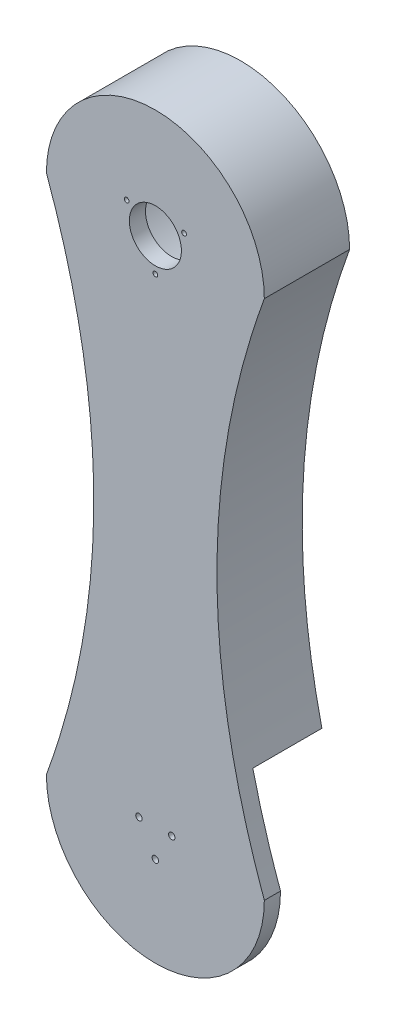
ISO-10303-21;
HEADER;
FILE_DESCRIPTION(('STEP AP214'),'2;1');
FILE_NAME('part.step','',(''),(''),'','','');
FILE_SCHEMA(('AUTOMOTIVE_DESIGN { 1 0 10303 214 1 1 1 1 }'));
ENDSEC;
DATA;
#1=APPLICATION_CONTEXT('core data for automotive mechanical design processes');
#2=APPLICATION_PROTOCOL_DEFINITION('international standard','automotive_design',2000,#1);
#3=PRODUCT_CONTEXT('',#1,'mechanical');
#4=PRODUCT('Part','Part','',(#3));
#5=PRODUCT_RELATED_PRODUCT_CATEGORY('part','',(#4));
#6=PRODUCT_DEFINITION_FORMATION('','',#4);
#7=PRODUCT_DEFINITION_CONTEXT('part definition',#1,'design');
#8=PRODUCT_DEFINITION('design','',#6,#7);
#9=PRODUCT_DEFINITION_SHAPE('','',#8);
#10=(LENGTH_UNIT() NAMED_UNIT(*) SI_UNIT(.MILLI.,.METRE.));
#11=(NAMED_UNIT(*) PLANE_ANGLE_UNIT() SI_UNIT($,.RADIAN.));
#12=(NAMED_UNIT(*) SI_UNIT($,.STERADIAN.) SOLID_ANGLE_UNIT());
#13=UNCERTAINTY_MEASURE_WITH_UNIT(LENGTH_MEASURE(1.E-05),#10,'distance_accuracy_value','');
#14=(GEOMETRIC_REPRESENTATION_CONTEXT(3) GLOBAL_UNCERTAINTY_ASSIGNED_CONTEXT((#13)) GLOBAL_UNIT_ASSIGNED_CONTEXT((#10,
#11,#12)) REPRESENTATION_CONTEXT('',''));
#15=CARTESIAN_POINT('',(0.,0.,0.));
#16=DIRECTION('',(0.,0.,1.));
#17=DIRECTION('',(1.,0.,0.));
#18=AXIS2_PLACEMENT_3D('',#15,#16,#17);
#19=CARTESIAN_POINT('',(0.,0.,90.));
#20=DIRECTION('',(0.,0.,-1.));
#21=DIRECTION('',(-1.,0.,0.));
#22=AXIS2_PLACEMENT_3D('',#19,#20,#21);
#23=CYLINDRICAL_SURFACE('',#22,115.);
#24=CARTESIAN_POINT('',(0.,0.,72.91));
#25=DIRECTION('',(0.,0.,-1.));
#26=DIRECTION('',(-1.,0.,0.));
#27=AXIS2_PLACEMENT_3D('',#24,#25,#26);
#28=CIRCLE('',#27,115.);
#29=CARTESIAN_POINT('',(-115.,0.,72.91));
#30=VERTEX_POINT('',#29);
#31=CARTESIAN_POINT('',(114.999999863721,3.75072417568845E-07,72.91));
#32=VERTEX_POINT('',#31);
#33=EDGE_CURVE('E194',#30,#32,#28,.F.);
#34=ORIENTED_EDGE('',*,*,#33,.T.);
#35=DIRECTION('',(0.,0.,-1.));
#36=VECTOR('',#35,1.);
#37=CARTESIAN_POINT('',(115.,0.,90.));
#38=LINE('',#37,#36);
#39=CARTESIAN_POINT('',(115.,0.,90.));
#40=VERTEX_POINT('',#39);
#41=EDGE_CURVE('E51',#40,#32,#38,.T.);
#42=ORIENTED_EDGE('',*,*,#41,.F.);
#43=CARTESIAN_POINT('',(0.,0.,90.));
#44=DIRECTION('',(0.,0.,1.));
#45=DIRECTION('',(1.,0.,0.));
#46=AXIS2_PLACEMENT_3D('',#43,#44,#45);
#47=CIRCLE('',#46,115.);
#48=CARTESIAN_POINT('',(-115.,0.,90.));
#49=VERTEX_POINT('',#48);
#50=EDGE_CURVE('E90',#49,#40,#47,.T.);
#51=ORIENTED_EDGE('',*,*,#50,.F.);
#52=DIRECTION('',(0.,0.,-1.));
#53=VECTOR('',#52,1.);
#54=CARTESIAN_POINT('',(-115.,0.,90.));
#55=LINE('',#54,#53);
#56=EDGE_CURVE('E11',#49,#30,#55,.T.);
#57=ORIENTED_EDGE('',*,*,#56,.T.);
#58=EDGE_LOOP('',(#34,#42,#51,#57));
#59=FACE_BOUND('',#58,.T.);
#60=ADVANCED_FACE('F39',(#59),#23,.T.);
#61=CARTESIAN_POINT('',(-115.,550.,90.));
#62=CARTESIAN_POINT('',(-15.,275.,90.));
#63=CARTESIAN_POINT('',(-115.,0.,90.));
#64=B_SPLINE_CURVE_WITH_KNOTS('',2,(#61,#62,#63),.UNSPECIFIED.,.F.,.F.,(3,3),(0.,1.),.UNSPECIFIED.);
#65=DIRECTION('',(0.,0.,-1.));
#66=VECTOR('',#65,1.);
#67=SURFACE_OF_LINEAR_EXTRUSION('',#64,#66);
#68=CARTESIAN_POINT('',(-115.,550.,0.));
#69=CARTESIAN_POINT('',(-15.,275.,0.));
#70=CARTESIAN_POINT('',(-115.,0.,0.));
#71=B_SPLINE_CURVE_WITH_KNOTS('',2,(#68,#69,#70),.UNSPECIFIED.,.F.,.F.,(3,3),(0.,1.),.UNSPECIFIED.);
#72=CARTESIAN_POINT('',(-115.,550.,0.));
#73=VERTEX_POINT('',#72);
#74=CARTESIAN_POINT('',(-85.785633536832,97.6915943209165,0.));
#75=VERTEX_POINT('',#74);
#76=EDGE_CURVE('E124',#73,#75,#71,.T.);
#77=ORIENTED_EDGE('',*,*,#76,.T.);
#78=DIRECTION('',(0.,0.,-1.));
#79=VECTOR('',#78,1.);
#80=CARTESIAN_POINT('',(-85.7856335369576,97.6915943208549,400.044320324586));
#81=LINE('',#80,#79);
#82=CARTESIAN_POINT('',(-85.7856335369576,97.6915943208549,72.91));
#83=VERTEX_POINT('',#82);
#84=EDGE_CURVE('E59',#83,#75,#81,.T.);
#85=ORIENTED_EDGE('',*,*,#84,.F.);
#86=CARTESIAN_POINT('',(-1000065.,-38615.8729652601,72.91));
#87=CARTESIAN_POINT('',(999935.,274.999999999999,72.91));
#88=CARTESIAN_POINT('',(-1000065.,39165.8729652601,72.91));
#89=B_SPLINE_CURVE_WITH_KNOTS('',2,(#86,#87,#88),.UNSPECIFIED.,.F.,.F.,(3,3),(0.,1.),.UNSPECIFIED.);
#90=EDGE_CURVE('E162',#83,#30,#89,.F.);
#91=ORIENTED_EDGE('',*,*,#90,.T.);
#92=ORIENTED_EDGE('',*,*,#56,.F.);
#93=CARTESIAN_POINT('',(-115.,550.,90.));
#94=VERTEX_POINT('',#93);
#95=EDGE_CURVE('E126',#94,#49,#64,.T.);
#96=ORIENTED_EDGE('',*,*,#95,.F.);
#97=DIRECTION('',(0.,0.,-1.));
#98=VECTOR('',#97,1.);
#99=CARTESIAN_POINT('',(-115.,550.,90.));
#100=LINE('',#99,#98);
#101=EDGE_CURVE('E146',#94,#73,#100,.T.);
#102=ORIENTED_EDGE('',*,*,#101,.T.);
#103=EDGE_LOOP('',(#77,#85,#91,#92,#96,#102));
#104=FACE_BOUND('',#103,.T.);
#105=ADVANCED_FACE('F41',(#104),#67,.F.);
#106=CARTESIAN_POINT('',(115.,0.,90.));
#107=CARTESIAN_POINT('',(15.,275.,90.));
#108=CARTESIAN_POINT('',(115.,550.,90.));
#109=B_SPLINE_CURVE_WITH_KNOTS('',2,(#106,#107,#108),.UNSPECIFIED.,.F.,.F.,(3,3),(0.,1.),.UNSPECIFIED.);
#110=DIRECTION('',(0.,0.,-1.));
#111=VECTOR('',#110,1.);
#112=SURFACE_OF_LINEAR_EXTRUSION('',#109,#111);
#113=CARTESIAN_POINT('',(1000065.,39165.8729652601,72.91));
#114=CARTESIAN_POINT('',(-999935.,274.999999999999,72.91));
#115=CARTESIAN_POINT('',(1000065.,-38615.8729652601,72.91));
#116=B_SPLINE_CURVE_WITH_KNOTS('',2,(#113,#114,#115),.UNSPECIFIED.,.F.,.F.,(3,3),(0.,1.),.UNSPECIFIED.);
#117=CARTESIAN_POINT('',(85.7856335369571,97.6915943208549,72.91));
#118=VERTEX_POINT('',#117);
#119=EDGE_CURVE('E120',#32,#118,#116,.F.);
#120=ORIENTED_EDGE('',*,*,#119,.T.);
#121=DIRECTION('',(0.,0.,-1.));
#122=VECTOR('',#121,1.);
#123=CARTESIAN_POINT('',(85.7856335369571,97.6915943208549,400.044320324586));
#124=LINE('',#123,#122);
#125=CARTESIAN_POINT('',(85.7856335369571,97.6915943208549,0.));
#126=VERTEX_POINT('',#125);
#127=EDGE_CURVE('E106',#118,#126,#124,.T.);
#128=ORIENTED_EDGE('',*,*,#127,.T.);
#129=CARTESIAN_POINT('',(115.,0.,0.));
#130=CARTESIAN_POINT('',(15.,275.,0.));
#131=CARTESIAN_POINT('',(115.,550.,0.));
#132=B_SPLINE_CURVE_WITH_KNOTS('',2,(#129,#130,#131),.UNSPECIFIED.,.F.,.F.,(3,3),(0.,1.),.UNSPECIFIED.);
#133=CARTESIAN_POINT('',(115.,550.,0.));
#134=VERTEX_POINT('',#133);
#135=EDGE_CURVE('E118',#126,#134,#132,.T.);
#136=ORIENTED_EDGE('',*,*,#135,.T.);
#137=DIRECTION('',(0.,0.,-1.));
#138=VECTOR('',#137,1.);
#139=CARTESIAN_POINT('',(115.,550.,90.));
#140=LINE('',#139,#138);
#141=CARTESIAN_POINT('',(115.,550.,90.));
#142=VERTEX_POINT('',#141);
#143=EDGE_CURVE('E148',#142,#134,#140,.T.);
#144=ORIENTED_EDGE('',*,*,#143,.F.);
#145=EDGE_CURVE('E175',#40,#142,#109,.T.);
#146=ORIENTED_EDGE('',*,*,#145,.F.);
#147=ORIENTED_EDGE('',*,*,#41,.T.);
#148=EDGE_LOOP('',(#120,#128,#136,#144,#146,#147));
#149=FACE_BOUND('',#148,.T.);
#150=ADVANCED_FACE('F116',(#149),#112,.F.);
#151=CARTESIAN_POINT('',(0.,550.,90.));
#152=DIRECTION('',(0.,0.,-1.));
#153=DIRECTION('',(-1.,0.,0.));
#154=AXIS2_PLACEMENT_3D('',#151,#152,#153);
#155=CYLINDRICAL_SURFACE('',#154,115.);
#156=CARTESIAN_POINT('',(0.,550.,0.));
#157=DIRECTION('',(0.,0.,1.));
#158=DIRECTION('',(1.,0.,0.));
#159=AXIS2_PLACEMENT_3D('',#156,#157,#158);
#160=CIRCLE('',#159,115.);
#161=EDGE_CURVE('E83',#134,#73,#160,.T.);
#162=ORIENTED_EDGE('',*,*,#161,.T.);
#163=ORIENTED_EDGE('',*,*,#101,.F.);
#164=CARTESIAN_POINT('',(0.,550.,90.));
#165=DIRECTION('',(0.,0.,1.));
#166=DIRECTION('',(1.,0.,0.));
#167=AXIS2_PLACEMENT_3D('',#164,#165,#166);
#168=CIRCLE('',#167,115.);
#169=EDGE_CURVE('E68',#142,#94,#168,.T.);
#170=ORIENTED_EDGE('',*,*,#169,.F.);
#171=ORIENTED_EDGE('',*,*,#143,.T.);
#172=EDGE_LOOP('',(#162,#163,#170,#171));
#173=FACE_BOUND('',#172,.T.);
#174=ADVANCED_FACE('F185',(#173),#155,.T.);
#175=CARTESIAN_POINT('',(-65.,275.,90.));
#176=DIRECTION('',(0.,0.,-1.));
#177=DIRECTION('',(-1.,0.,0.));
#178=AXIS2_PLACEMENT_3D('',#175,#176,#177);
#179=PLANE('',#178);
#180=CARTESIAN_POINT('',(-30.3108891324553,567.5,90.));
#181=DIRECTION('',(0.,0.,1.));
#182=DIRECTION('',(-0.500000000000004,-0.866025403784436,0.));
#183=AXIS2_PLACEMENT_3D('',#180,#181,#182);
#184=CIRCLE('',#183,2.5);
#185=CARTESIAN_POINT('',(-31.5608891324553,565.334936490539,90.));
#186=VERTEX_POINT('',#185);
#187=EDGE_CURVE('E289',#186,#186,#184,.T.);
#188=ORIENTED_EDGE('',*,*,#187,.F.);
#189=EDGE_LOOP('',(#188));
#190=FACE_BOUND('',#189,.T.);
#191=CARTESIAN_POINT('',(30.3108891324556,567.5,90.));
#192=DIRECTION('',(0.,0.,1.));
#193=DIRECTION('',(-0.499999999999992,0.866025403784443,0.));
#194=AXIS2_PLACEMENT_3D('',#191,#192,#193);
#195=CIRCLE('',#194,2.5);
#196=CARTESIAN_POINT('',(29.0608891324556,569.665063509461,90.));
#197=VERTEX_POINT('',#196);
#198=EDGE_CURVE('E300',#197,#197,#195,.T.);
#199=ORIENTED_EDGE('',*,*,#198,.F.);
#200=EDGE_LOOP('',(#199));
#201=FACE_BOUND('',#200,.T.);
#202=CARTESIAN_POINT('',(0.,515.,90.));
#203=DIRECTION('',(0.,0.,1.));
#204=DIRECTION('',(1.,0.,0.));
#205=AXIS2_PLACEMENT_3D('',#202,#203,#204);
#206=CIRCLE('',#205,2.5);
#207=CARTESIAN_POINT('',(2.5,515.,90.));
#208=VERTEX_POINT('',#207);
#209=EDGE_CURVE('E292',#208,#208,#206,.T.);
#210=ORIENTED_EDGE('',*,*,#209,.F.);
#211=EDGE_LOOP('',(#210));
#212=FACE_BOUND('',#211,.T.);
#213=CARTESIAN_POINT('',(0.,-20.,90.));
#214=DIRECTION('',(0.,0.,-1.));
#215=DIRECTION('',(-1.,0.,0.));
#216=AXIS2_PLACEMENT_3D('',#213,#214,#215);
#217=CIRCLE('',#216,3.4);
#218=CARTESIAN_POINT('',(-3.4,-20.,90.));
#219=VERTEX_POINT('',#218);
#220=EDGE_CURVE('E112',#219,#219,#217,.F.);
#221=ORIENTED_EDGE('',*,*,#220,.F.);
#222=EDGE_LOOP('',(#221));
#223=FACE_BOUND('',#222,.T.);
#224=CARTESIAN_POINT('',(-17.3205080756887,10.0000000000001,90.));
#225=DIRECTION('',(0.,0.,-1.));
#226=DIRECTION('',(-1.,0.,0.));
#227=AXIS2_PLACEMENT_3D('',#224,#225,#226);
#228=CIRCLE('',#227,3.4);
#229=CARTESIAN_POINT('',(-20.7205080756887,10.0000000000001,90.));
#230=VERTEX_POINT('',#229);
#231=EDGE_CURVE('E314',#230,#230,#228,.F.);
#232=ORIENTED_EDGE('',*,*,#231,.F.);
#233=EDGE_LOOP('',(#232));
#234=FACE_BOUND('',#233,.T.);
#235=CARTESIAN_POINT('',(17.3205080756889,9.99999999999983,90.));
#236=DIRECTION('',(0.,0.,-1.));
#237=DIRECTION('',(-1.,0.,0.));
#238=AXIS2_PLACEMENT_3D('',#235,#236,#237);
#239=CIRCLE('',#238,3.4);
#240=CARTESIAN_POINT('',(13.9205080756889,9.99999999999983,90.));
#241=VERTEX_POINT('',#240);
#242=EDGE_CURVE('E307',#241,#241,#239,.F.);
#243=ORIENTED_EDGE('',*,*,#242,.F.);
#244=EDGE_LOOP('',(#243));
#245=FACE_BOUND('',#244,.T.);
#246=CARTESIAN_POINT('',(0.,550.,90.));
#247=DIRECTION('',(0.,0.,-1.));
#248=DIRECTION('',(-1.,0.,0.));
#249=AXIS2_PLACEMENT_3D('',#246,#247,#248);
#250=CIRCLE('',#249,27.5);
#251=CARTESIAN_POINT('',(-27.5,550.,90.));
#252=VERTEX_POINT('',#251);
#253=EDGE_CURVE('E149',#252,#252,#250,.T.);
#254=ORIENTED_EDGE('',*,*,#253,.T.);
#255=EDGE_LOOP('',(#254));
#256=FACE_BOUND('',#255,.T.);
#257=ORIENTED_EDGE('',*,*,#95,.T.);
#258=ORIENTED_EDGE('',*,*,#50,.T.);
#259=ORIENTED_EDGE('',*,*,#145,.T.);
#260=ORIENTED_EDGE('',*,*,#169,.T.);
#261=EDGE_LOOP('',(#257,#258,#259,#260));
#262=FACE_BOUND('',#261,.T.);
#263=ADVANCED_FACE('F201',(#190,#201,#212,#223,#234,#245,#256,#262),#179,.F.);
#264=CARTESIAN_POINT('',(-65.,275.,0.));
#265=DIRECTION('',(0.,0.,-1.));
#266=DIRECTION('',(-1.,0.,0.));
#267=AXIS2_PLACEMENT_3D('',#264,#265,#266);
#268=PLANE('',#267);
#269=CARTESIAN_POINT('',(-2.22044604925031E-13,-76.8838557921613,0.));
#270=DIRECTION('',(0.,0.,-1.));
#271=DIRECTION('',(-1.,0.,0.));
#272=AXIS2_PLACEMENT_3D('',#269,#270,#271);
#273=CIRCLE('',#272,194.514170958055);
#274=EDGE_CURVE('E103',#75,#126,#273,.T.);
#275=ORIENTED_EDGE('',*,*,#274,.F.);
#276=ORIENTED_EDGE('',*,*,#76,.F.);
#277=ORIENTED_EDGE('',*,*,#161,.F.);
#278=ORIENTED_EDGE('',*,*,#135,.F.);
#279=EDGE_LOOP('',(#275,#276,#277,#278));
#280=FACE_BOUND('',#279,.T.);
#281=CARTESIAN_POINT('',(0.,550.,0.));
#282=DIRECTION('',(0.,0.,-1.));
#283=DIRECTION('',(-1.,0.,0.));
#284=AXIS2_PLACEMENT_3D('',#281,#282,#283);
#285=CIRCLE('',#284,97.5);
#286=CARTESIAN_POINT('',(-97.5,550.,0.));
#287=VERTEX_POINT('',#286);
#288=EDGE_CURVE('E151',#287,#287,#285,.T.);
#289=ORIENTED_EDGE('',*,*,#288,.F.);
#290=EDGE_LOOP('',(#289));
#291=FACE_BOUND('',#290,.T.);
#292=ADVANCED_FACE('F122',(#280,#291),#268,.T.);
#293=CARTESIAN_POINT('',(0.,550.,72.91));
#294=DIRECTION('',(0.,0.,-1.));
#295=DIRECTION('',(-1.,0.,0.));
#296=AXIS2_PLACEMENT_3D('',#293,#294,#295);
#297=CYLINDRICAL_SURFACE('',#296,97.5);
#298=CARTESIAN_POINT('',(0.,550.,72.91));
#299=DIRECTION('',(0.,0.,-1.));
#300=DIRECTION('',(-1.,0.,0.));
#301=AXIS2_PLACEMENT_3D('',#298,#299,#300);
#302=CIRCLE('',#301,97.5);
#303=CARTESIAN_POINT('',(-97.5,550.,72.91));
#304=VERTEX_POINT('',#303);
#305=EDGE_CURVE('E128',#304,#304,#302,.T.);
#306=ORIENTED_EDGE('',*,*,#305,.F.);
#307=EDGE_LOOP('',(#306));
#308=FACE_BOUND('',#307,.T.);
#309=ORIENTED_EDGE('',*,*,#288,.T.);
#310=EDGE_LOOP('',(#309));
#311=FACE_BOUND('',#310,.T.);
#312=ADVANCED_FACE('F241',(#308,#311),#297,.F.);
#313=CARTESIAN_POINT('',(0.,550.,72.91));
#314=DIRECTION('',(0.,0.,-1.));
#315=DIRECTION('',(-1.,0.,0.));
#316=AXIS2_PLACEMENT_3D('',#313,#314,#315);
#317=PLANE('',#316);
#318=CARTESIAN_POINT('',(-30.3108891324553,567.5,72.91));
#319=DIRECTION('',(0.,0.,-1.));
#320=DIRECTION('',(-1.,0.,0.));
#321=AXIS2_PLACEMENT_3D('',#318,#319,#320);
#322=CIRCLE('',#321,2.5);
#323=CARTESIAN_POINT('',(-32.8108891324553,567.5,72.91));
#324=VERTEX_POINT('',#323);
#325=EDGE_CURVE('E291',#324,#324,#322,.F.);
#326=ORIENTED_EDGE('',*,*,#325,.T.);
#327=EDGE_LOOP('',(#326));
#328=FACE_BOUND('',#327,.T.);
#329=CARTESIAN_POINT('',(30.3108891324556,567.5,72.91));
#330=DIRECTION('',(0.,0.,-1.));
#331=DIRECTION('',(-1.,0.,0.));
#332=AXIS2_PLACEMENT_3D('',#329,#330,#331);
#333=CIRCLE('',#332,2.5);
#334=CARTESIAN_POINT('',(27.8108891324556,567.5,72.91));
#335=VERTEX_POINT('',#334);
#336=EDGE_CURVE('E297',#335,#335,#333,.F.);
#337=ORIENTED_EDGE('',*,*,#336,.T.);
#338=EDGE_LOOP('',(#337));
#339=FACE_BOUND('',#338,.T.);
#340=CARTESIAN_POINT('',(0.,515.,72.91));
#341=DIRECTION('',(0.,0.,-1.));
#342=DIRECTION('',(-1.,0.,0.));
#343=AXIS2_PLACEMENT_3D('',#340,#341,#342);
#344=CIRCLE('',#343,2.5);
#345=CARTESIAN_POINT('',(-2.5,515.,72.91));
#346=VERTEX_POINT('',#345);
#347=EDGE_CURVE('E295',#346,#346,#344,.F.);
#348=ORIENTED_EDGE('',*,*,#347,.T.);
#349=EDGE_LOOP('',(#348));
#350=FACE_BOUND('',#349,.T.);
#351=CARTESIAN_POINT('',(0.,550.,72.91));
#352=DIRECTION('',(0.,0.,-1.));
#353=DIRECTION('',(-1.,0.,0.));
#354=AXIS2_PLACEMENT_3D('',#351,#352,#353);
#355=CIRCLE('',#354,27.5);
#356=CARTESIAN_POINT('',(-27.5,550.,72.91));
#357=VERTEX_POINT('',#356);
#358=EDGE_CURVE('E152',#357,#357,#355,.T.);
#359=ORIENTED_EDGE('',*,*,#358,.F.);
#360=EDGE_LOOP('',(#359));
#361=FACE_BOUND('',#360,.T.);
#362=ORIENTED_EDGE('',*,*,#305,.T.);
#363=EDGE_LOOP('',(#362));
#364=FACE_BOUND('',#363,.T.);
#365=ADVANCED_FACE('F249',(#328,#339,#350,#361,#364),#317,.T.);
#366=CARTESIAN_POINT('',(0.,550.,145.82));
#367=DIRECTION('',(0.,0.,-1.));
#368=DIRECTION('',(-1.,0.,0.));
#369=AXIS2_PLACEMENT_3D('',#366,#367,#368);
#370=CYLINDRICAL_SURFACE('',#369,27.5);
#371=ORIENTED_EDGE('',*,*,#358,.T.);
#372=EDGE_LOOP('',(#371));
#373=FACE_BOUND('',#372,.T.);
#374=ORIENTED_EDGE('',*,*,#253,.F.);
#375=EDGE_LOOP('',(#374));
#376=FACE_BOUND('',#375,.T.);
#377=ADVANCED_FACE('F235',(#373,#376),#370,.F.);
#378=CARTESIAN_POINT('',(-2.22044604925031E-13,-76.8838557921613,400.044320324586));
#379=DIRECTION('',(0.,0.,-1.));
#380=DIRECTION('',(-1.,0.,0.));
#381=AXIS2_PLACEMENT_3D('',#378,#379,#380);
#382=CYLINDRICAL_SURFACE('',#381,194.514170958055);
#383=CARTESIAN_POINT('',(-2.22044604925031E-13,-76.8838557921613,72.91));
#384=DIRECTION('',(0.,0.,-1.));
#385=DIRECTION('',(-1.,0.,0.));
#386=AXIS2_PLACEMENT_3D('',#383,#384,#385);
#387=CIRCLE('',#386,194.514170958055);
#388=EDGE_CURVE('E158',#118,#83,#387,.F.);
#389=ORIENTED_EDGE('',*,*,#388,.T.);
#390=ORIENTED_EDGE('',*,*,#84,.T.);
#391=ORIENTED_EDGE('',*,*,#274,.T.);
#392=ORIENTED_EDGE('',*,*,#127,.F.);
#393=EDGE_LOOP('',(#389,#390,#391,#392));
#394=FACE_BOUND('',#393,.T.);
#395=ADVANCED_FACE('F105',(#394),#382,.F.);
#396=CARTESIAN_POINT('',(0.,0.,72.91));
#397=DIRECTION('',(0.,0.,-1.));
#398=DIRECTION('',(-1.,0.,0.));
#399=AXIS2_PLACEMENT_3D('',#396,#397,#398);
#400=PLANE('',#399);
#401=CARTESIAN_POINT('',(0.,-20.,72.91));
#402=DIRECTION('',(0.,0.,-1.));
#403=DIRECTION('',(-1.,0.,0.));
#404=AXIS2_PLACEMENT_3D('',#401,#402,#403);
#405=CIRCLE('',#404,3.4);
#406=CARTESIAN_POINT('',(-3.4,-20.,72.91));
#407=VERTEX_POINT('',#406);
#408=EDGE_CURVE('E308',#407,#407,#405,.T.);
#409=ORIENTED_EDGE('',*,*,#408,.F.);
#410=EDGE_LOOP('',(#409));
#411=FACE_BOUND('',#410,.T.);
#412=CARTESIAN_POINT('',(-17.3205080756887,10.0000000000001,72.91));
#413=DIRECTION('',(0.,0.,-1.));
#414=DIRECTION('',(-1.,0.,0.));
#415=AXIS2_PLACEMENT_3D('',#412,#413,#414);
#416=CIRCLE('',#415,3.4);
#417=CARTESIAN_POINT('',(-20.7205080756887,10.0000000000001,72.91));
#418=VERTEX_POINT('',#417);
#419=EDGE_CURVE('E311',#418,#418,#416,.T.);
#420=ORIENTED_EDGE('',*,*,#419,.F.);
#421=EDGE_LOOP('',(#420));
#422=FACE_BOUND('',#421,.T.);
#423=CARTESIAN_POINT('',(17.3205080756889,9.99999999999983,72.91));
#424=DIRECTION('',(0.,0.,-1.));
#425=DIRECTION('',(-1.,0.,0.));
#426=AXIS2_PLACEMENT_3D('',#423,#424,#425);
#427=CIRCLE('',#426,3.4);
#428=CARTESIAN_POINT('',(13.9205080756889,9.99999999999983,72.91));
#429=VERTEX_POINT('',#428);
#430=EDGE_CURVE('E317',#429,#429,#427,.T.);
#431=ORIENTED_EDGE('',*,*,#430,.F.);
#432=EDGE_LOOP('',(#431));
#433=FACE_BOUND('',#432,.T.);
#434=ORIENTED_EDGE('',*,*,#90,.F.);
#435=ORIENTED_EDGE('',*,*,#388,.F.);
#436=ORIENTED_EDGE('',*,*,#119,.F.);
#437=ORIENTED_EDGE('',*,*,#33,.F.);
#438=EDGE_LOOP('',(#434,#435,#436,#437));
#439=FACE_BOUND('',#438,.T.);
#440=ADVANCED_FACE('F223',(#411,#422,#433,#439),#400,.T.);
#441=CARTESIAN_POINT('',(17.3205080756889,9.99999999999983,99.616652224137));
#442=DIRECTION('',(0.,0.,-1.));
#443=DIRECTION('',(-1.,0.,0.));
#444=AXIS2_PLACEMENT_3D('',#441,#442,#443);
#445=CYLINDRICAL_SURFACE('',#444,3.4);
#446=ORIENTED_EDGE('',*,*,#242,.T.);
#447=EDGE_LOOP('',(#446));
#448=FACE_BOUND('',#447,.T.);
#449=ORIENTED_EDGE('',*,*,#430,.T.);
#450=EDGE_LOOP('',(#449));
#451=FACE_BOUND('',#450,.T.);
#452=ADVANCED_FACE('F225',(#448,#451),#445,.F.);
#453=CARTESIAN_POINT('',(-17.3205080756887,10.0000000000001,99.616652224137));
#454=DIRECTION('',(0.,0.,-1.));
#455=DIRECTION('',(-1.,0.,0.));
#456=AXIS2_PLACEMENT_3D('',#453,#454,#455);
#457=CYLINDRICAL_SURFACE('',#456,3.4);
#458=ORIENTED_EDGE('',*,*,#231,.T.);
#459=EDGE_LOOP('',(#458));
#460=FACE_BOUND('',#459,.T.);
#461=ORIENTED_EDGE('',*,*,#419,.T.);
#462=EDGE_LOOP('',(#461));
#463=FACE_BOUND('',#462,.T.);
#464=ADVANCED_FACE('F232',(#460,#463),#457,.F.);
#465=CARTESIAN_POINT('',(0.,-20.,99.616652224137));
#466=DIRECTION('',(0.,0.,-1.));
#467=DIRECTION('',(-1.,0.,0.));
#468=AXIS2_PLACEMENT_3D('',#465,#466,#467);
#469=CYLINDRICAL_SURFACE('',#468,3.4);
#470=ORIENTED_EDGE('',*,*,#220,.T.);
#471=EDGE_LOOP('',(#470));
#472=FACE_BOUND('',#471,.T.);
#473=ORIENTED_EDGE('',*,*,#408,.T.);
#474=EDGE_LOOP('',(#473));
#475=FACE_BOUND('',#474,.T.);
#476=ADVANCED_FACE('F269',(#472,#475),#469,.F.);
#477=CARTESIAN_POINT('',(0.,515.,65.8389321881346));
#478=DIRECTION('',(0.,0.,1.));
#479=DIRECTION('',(1.,0.,0.));
#480=AXIS2_PLACEMENT_3D('',#477,#478,#479);
#481=CYLINDRICAL_SURFACE('',#480,2.5);
#482=ORIENTED_EDGE('',*,*,#209,.T.);
#483=EDGE_LOOP('',(#482));
#484=FACE_BOUND('',#483,.T.);
#485=ORIENTED_EDGE('',*,*,#347,.F.);
#486=EDGE_LOOP('',(#485));
#487=FACE_BOUND('',#486,.T.);
#488=ADVANCED_FACE('F273',(#484,#487),#481,.F.);
#489=CARTESIAN_POINT('',(30.3108891324556,567.5,65.8389321881346));
#490=DIRECTION('',(0.,0.,1.));
#491=DIRECTION('',(1.,0.,0.));
#492=AXIS2_PLACEMENT_3D('',#489,#490,#491);
#493=CYLINDRICAL_SURFACE('',#492,2.5);
#494=ORIENTED_EDGE('',*,*,#198,.T.);
#495=EDGE_LOOP('',(#494));
#496=FACE_BOUND('',#495,.T.);
#497=ORIENTED_EDGE('',*,*,#336,.F.);
#498=EDGE_LOOP('',(#497));
#499=FACE_BOUND('',#498,.T.);
#500=ADVANCED_FACE('F277',(#496,#499),#493,.F.);
#501=CARTESIAN_POINT('',(-30.3108891324553,567.5,65.8389321881346));
#502=DIRECTION('',(0.,0.,1.));
#503=DIRECTION('',(1.,0.,0.));
#504=AXIS2_PLACEMENT_3D('',#501,#502,#503);
#505=CYLINDRICAL_SURFACE('',#504,2.5);
#506=ORIENTED_EDGE('',*,*,#187,.T.);
#507=EDGE_LOOP('',(#506));
#508=FACE_BOUND('',#507,.T.);
#509=ORIENTED_EDGE('',*,*,#325,.F.);
#510=EDGE_LOOP('',(#509));
#511=FACE_BOUND('',#510,.T.);
#512=ADVANCED_FACE('F280',(#508,#511),#505,.F.);
#513=CLOSED_SHELL('',(#60,#105,#150,#174,#263,#292,#312,#365,#377,#395,#440,#452,#464,#476,#488,
#500,#512));
#514=MANIFOLD_SOLID_BREP('B2',#513);
#515=ADVANCED_BREP_SHAPE_REPRESENTATION('',(#18,#514),#14);
#516=SHAPE_DEFINITION_REPRESENTATION(#9,#515);
ENDSEC;
END-ISO-10303-21;
